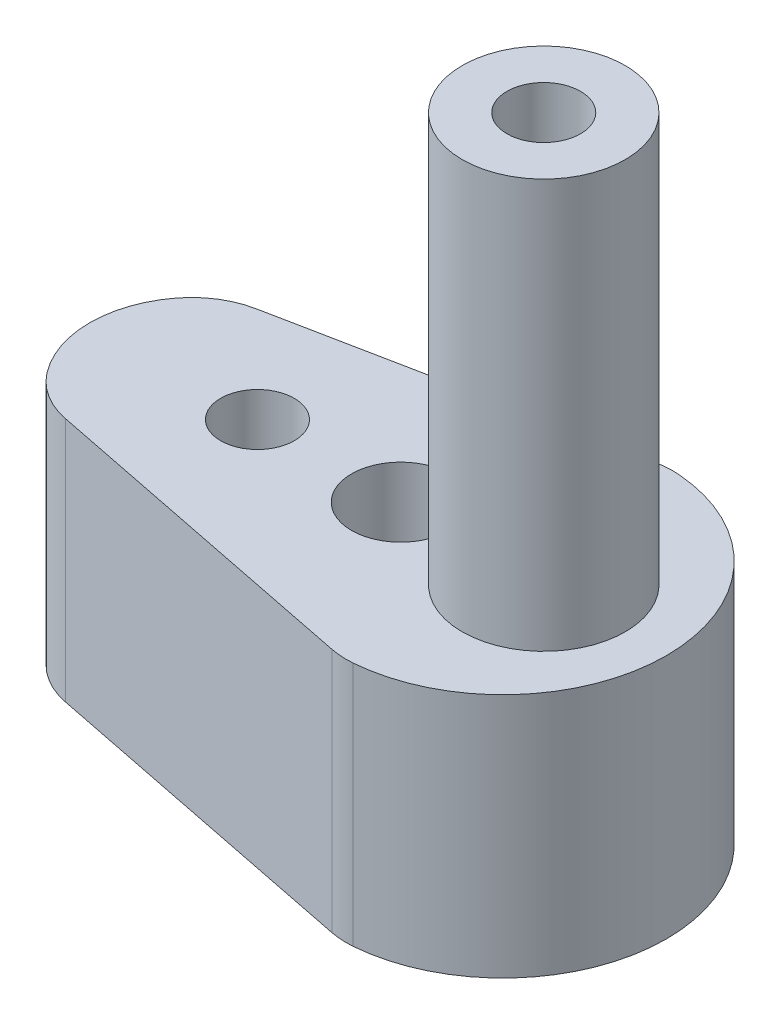
ISO-10303-21;
HEADER;
FILE_DESCRIPTION(('STEP AP214'),'2;1');
FILE_NAME('part.step','',(''),(''),'','','');
FILE_SCHEMA(('AUTOMOTIVE_DESIGN { 1 0 10303 214 1 1 1 1 }'));
ENDSEC;
DATA;
#1=APPLICATION_CONTEXT('core data for automotive mechanical design processes');
#2=APPLICATION_PROTOCOL_DEFINITION('international standard','automotive_design',2000,#1);
#3=PRODUCT_CONTEXT('',#1,'mechanical');
#4=PRODUCT('Part','Part','',(#3));
#5=PRODUCT_RELATED_PRODUCT_CATEGORY('part','',(#4));
#6=PRODUCT_DEFINITION_FORMATION('','',#4);
#7=PRODUCT_DEFINITION_CONTEXT('part definition',#1,'design');
#8=PRODUCT_DEFINITION('design','',#6,#7);
#9=PRODUCT_DEFINITION_SHAPE('','',#8);
#10=(LENGTH_UNIT() NAMED_UNIT(*) SI_UNIT(.MILLI.,.METRE.));
#11=(NAMED_UNIT(*) PLANE_ANGLE_UNIT() SI_UNIT($,.RADIAN.));
#12=(NAMED_UNIT(*) SI_UNIT($,.STERADIAN.) SOLID_ANGLE_UNIT());
#13=UNCERTAINTY_MEASURE_WITH_UNIT(LENGTH_MEASURE(1.E-05),#10,'distance_accuracy_value','');
#14=(GEOMETRIC_REPRESENTATION_CONTEXT(3) GLOBAL_UNCERTAINTY_ASSIGNED_CONTEXT((#13)) GLOBAL_UNIT_ASSIGNED_CONTEXT((#10,
#11,#12)) REPRESENTATION_CONTEXT('',''));
#15=CARTESIAN_POINT('',(0.,0.,0.));
#16=DIRECTION('',(0.,0.,1.));
#17=DIRECTION('',(1.,0.,0.));
#18=AXIS2_PLACEMENT_3D('',#15,#16,#17);
#19=CARTESIAN_POINT('',(0.,3.,0.));
#20=DIRECTION('',(0.,1.,0.));
#21=DIRECTION('',(0.,0.,1.));
#22=AXIS2_PLACEMENT_3D('',#19,#20,#21);
#23=PLANE('',#22);
#24=CARTESIAN_POINT('',(-1.24999999999968,3.,0.));
#25=DIRECTION('',(0.,1.,0.));
#26=DIRECTION('',(0.,0.,1.));
#27=AXIS2_PLACEMENT_3D('',#24,#25,#26);
#28=CIRCLE('',#27,0.6);
#29=CARTESIAN_POINT('',(-1.24999999999968,3.,0.599999999999994));
#30=VERTEX_POINT('',#29);
#31=EDGE_CURVE('E179',#30,#30,#28,.T.);
#32=ORIENTED_EDGE('',*,*,#31,.F.);
#33=EDGE_LOOP('',(#32));
#34=FACE_BOUND('',#33,.T.);
#35=CARTESIAN_POINT('',(-3.9873014814638,3.,0.183542929297438));
#36=DIRECTION('',(0.,1.,0.));
#37=DIRECTION('',(0.,0.,1.));
#38=AXIS2_PLACEMENT_3D('',#35,#36,#37);
#39=CIRCLE('',#38,1.);
#40=CARTESIAN_POINT('',(-4.183235690524,3.,1.16415997265328));
#41=VERTEX_POINT('',#40);
#42=CARTESIAN_POINT('',(-4.77830641967648,3.,0.795352693622231));
#43=VERTEX_POINT('',#42);
#44=EDGE_CURVE('E200',#41,#43,#39,.F.);
#45=ORIENTED_EDGE('',*,*,#44,.F.);
#46=DIRECTION('',(-0.980617043355843,0.,-0.195934209060197));
#47=VECTOR('',#46,1.);
#48=CARTESIAN_POINT('',(-0.384272849561752,3.,1.92321957143991));
#49=LINE('',#48,#47);
#50=CARTESIAN_POINT('',(-0.113883759971435,3.,1.97724522066388));
#51=VERTEX_POINT('',#50);
#52=EDGE_CURVE('E202',#51,#41,#49,.T.);
#53=ORIENTED_EDGE('',*,*,#52,.F.);
#54=CARTESIAN_POINT('',(0.0820504490887623,3.,0.996628177308034));
#55=DIRECTION('',(0.,1.,0.));
#56=DIRECTION('',(0.,0.,1.));
#57=AXIS2_PLACEMENT_3D('',#54,#55,#56);
#58=CIRCLE('',#57,1.);
#59=CARTESIAN_POINT('',(0.164100898177525,3.,1.99325635461607));
#60=VERTEX_POINT('',#59);
#61=EDGE_CURVE('E145',#51,#60,#58,.T.);
#62=ORIENTED_EDGE('',*,*,#61,.T.);
#63=CARTESIAN_POINT('',(-1.05819487287301E-11,3.,-1.28546370596616E-10));
#64=DIRECTION('',(0.,1.,0.));
#65=DIRECTION('',(0.,0.,1.));
#66=AXIS2_PLACEMENT_3D('',#63,#64,#65);
#67=CIRCLE('',#66,2.00000000012898);
#68=CARTESIAN_POINT('',(0.164100899999999,3.,-1.99325635472312));
#69=VERTEX_POINT('',#68);
#70=EDGE_CURVE('E205',#69,#60,#67,.F.);
#71=ORIENTED_EDGE('',*,*,#70,.F.);
#72=CARTESIAN_POINT('',(0.0820504499999999,3.,-0.996628177490106));
#73=DIRECTION('',(0.,1.,0.));
#74=DIRECTION('',(0.,0.,1.));
#75=AXIS2_PLACEMENT_3D('',#72,#73,#74);
#76=CIRCLE('',#75,1.);
#77=CARTESIAN_POINT('',(-0.113883759060197,3.,-1.97724522084595));
#78=VERTEX_POINT('',#77);
#79=EDGE_CURVE('E121',#69,#78,#76,.T.);
#80=ORIENTED_EDGE('',*,*,#79,.T.);
#81=DIRECTION('',(-0.980617043355843,0.,0.195934209060197));
#82=VECTOR('',#81,1.);
#83=CARTESIAN_POINT('',(-0.384272849561752,3.,-1.92321957143991));
#84=LINE('',#83,#82);
#85=CARTESIAN_POINT('',(-4.183235690524,3.,-1.16415997265328));
#86=VERTEX_POINT('',#85);
#87=EDGE_CURVE('E115',#78,#86,#84,.T.);
#88=ORIENTED_EDGE('',*,*,#87,.T.);
#89=CARTESIAN_POINT('',(-3.9873014814638,3.,-0.183542929297438));
#90=DIRECTION('',(0.,1.,0.));
#91=DIRECTION('',(0.,0.,1.));
#92=AXIS2_PLACEMENT_3D('',#89,#90,#91);
#93=CIRCLE('',#92,1.);
#94=CARTESIAN_POINT('',(-4.77830641967648,3.,-0.795352693622231));
#95=VERTEX_POINT('',#94);
#96=EDGE_CURVE('E107',#86,#95,#93,.T.);
#97=ORIENTED_EDGE('',*,*,#96,.T.);
#98=CARTESIAN_POINT('',(-3.75,3.,0.));
#99=DIRECTION('',(0.,1.,0.));
#100=DIRECTION('',(0.,0.,1.));
#101=AXIS2_PLACEMENT_3D('',#98,#99,#100);
#102=CIRCLE('',#101,1.3);
#103=EDGE_CURVE('E54',#95,#43,#102,.T.);
#104=ORIENTED_EDGE('',*,*,#103,.T.);
#105=EDGE_LOOP('',(#45,#53,#62,#71,#80,#88,#97,#104));
#106=FACE_BOUND('',#105,.T.);
#107=CARTESIAN_POINT('',(-3.,3.,0.));
#108=DIRECTION('',(0.,1.,0.));
#109=DIRECTION('',(0.,0.,1.));
#110=AXIS2_PLACEMENT_3D('',#107,#108,#109);
#111=CIRCLE('',#110,0.45);
#112=CARTESIAN_POINT('',(-3.,3.,0.45));
#113=VERTEX_POINT('',#112);
#114=EDGE_CURVE('E178',#113,#113,#111,.T.);
#115=ORIENTED_EDGE('',*,*,#114,.F.);
#116=EDGE_LOOP('',(#115));
#117=FACE_BOUND('',#116,.T.);
#118=CARTESIAN_POINT('',(0.5,3.,0.));
#119=DIRECTION('',(0.,1.,0.));
#120=DIRECTION('',(0.,0.,1.));
#121=AXIS2_PLACEMENT_3D('',#118,#119,#120);
#122=CIRCLE('',#121,0.996628177308034);
#123=CARTESIAN_POINT('',(0.5,3.,0.996628177308034));
#124=VERTEX_POINT('',#123);
#125=EDGE_CURVE('E186',#124,#124,#122,.F.);
#126=ORIENTED_EDGE('',*,*,#125,.T.);
#127=EDGE_LOOP('',(#126));
#128=FACE_BOUND('',#127,.T.);
#129=ADVANCED_FACE('F37',(#34,#106,#117,#128),#23,.T.);
#130=CARTESIAN_POINT('',(-3.9873014814638,3.,0.183542929297438));
#131=DIRECTION('',(0.,-1.,0.));
#132=DIRECTION('',(0.,0.,-1.));
#133=AXIS2_PLACEMENT_3D('',#130,#131,#132);
#134=CYLINDRICAL_SURFACE('',#133,1.);
#135=CARTESIAN_POINT('',(-3.9873014814638,0.,0.183542929297438));
#136=DIRECTION('',(0.,1.,0.));
#137=DIRECTION('',(0.,0.,1.));
#138=AXIS2_PLACEMENT_3D('',#135,#136,#137);
#139=CIRCLE('',#138,1.);
#140=CARTESIAN_POINT('',(-4.183235690524,0.,1.16415997265328));
#141=VERTEX_POINT('',#140);
#142=CARTESIAN_POINT('',(-4.77830641967648,0.,0.795352693622231));
#143=VERTEX_POINT('',#142);
#144=EDGE_CURVE('E159',#141,#143,#139,.F.);
#145=ORIENTED_EDGE('',*,*,#144,.F.);
#146=DIRECTION('',(0.,-1.,0.));
#147=VECTOR('',#146,1.);
#148=CARTESIAN_POINT('',(-4.183235690524,3.,1.16415997265328));
#149=LINE('',#148,#147);
#150=EDGE_CURVE('E11',#41,#141,#149,.T.);
#151=ORIENTED_EDGE('',*,*,#150,.F.);
#152=ORIENTED_EDGE('',*,*,#44,.T.);
#153=DIRECTION('',(0.,-1.,0.));
#154=VECTOR('',#153,1.);
#155=CARTESIAN_POINT('',(-4.77830641967648,3.,0.795352693622231));
#156=LINE('',#155,#154);
#157=EDGE_CURVE('E88',#43,#143,#156,.T.);
#158=ORIENTED_EDGE('',*,*,#157,.T.);
#159=EDGE_LOOP('',(#145,#151,#152,#158));
#160=FACE_BOUND('',#159,.T.);
#161=ADVANCED_FACE('F210',(#160),#134,.T.);
#162=CARTESIAN_POINT('',(-0.384272849561752,3.,1.92321957143991));
#163=DIRECTION('',(-0.195934209060197,0.,0.980617043355843));
#164=DIRECTION('',(0.980617043355843,0.,0.195934209060197));
#165=AXIS2_PLACEMENT_3D('',#162,#163,#164);
#166=PLANE('',#165);
#167=DIRECTION('',(-0.980617043355843,0.,-0.195934209060197));
#168=VECTOR('',#167,1.);
#169=CARTESIAN_POINT('',(-0.384272849561752,0.,1.92321957143991));
#170=LINE('',#169,#168);
#171=CARTESIAN_POINT('',(-0.113883759971435,0.,1.97724522066388));
#172=VERTEX_POINT('',#171);
#173=EDGE_CURVE('E153',#172,#141,#170,.T.);
#174=ORIENTED_EDGE('',*,*,#173,.F.);
#175=DIRECTION('',(0.,-1.,0.));
#176=VECTOR('',#175,1.);
#177=CARTESIAN_POINT('',(-0.113883759971435,3.,1.97724522066388));
#178=LINE('',#177,#176);
#179=EDGE_CURVE('E46',#51,#172,#178,.T.);
#180=ORIENTED_EDGE('',*,*,#179,.F.);
#181=ORIENTED_EDGE('',*,*,#52,.T.);
#182=ORIENTED_EDGE('',*,*,#150,.T.);
#183=EDGE_LOOP('',(#174,#180,#181,#182));
#184=FACE_BOUND('',#183,.T.);
#185=ADVANCED_FACE('F158',(#184),#166,.T.);
#186=CARTESIAN_POINT('',(0.0820504490887623,3.,0.996628177308034));
#187=DIRECTION('',(0.,-1.,0.));
#188=DIRECTION('',(0.,0.,-1.));
#189=AXIS2_PLACEMENT_3D('',#186,#187,#188);
#190=CYLINDRICAL_SURFACE('',#189,1.);
#191=CARTESIAN_POINT('',(0.0820504490887623,0.,0.996628177308034));
#192=DIRECTION('',(0.,1.,0.));
#193=DIRECTION('',(0.,0.,1.));
#194=AXIS2_PLACEMENT_3D('',#191,#192,#193);
#195=CIRCLE('',#194,1.);
#196=CARTESIAN_POINT('',(0.164100898177525,0.,1.99325635461607));
#197=VERTEX_POINT('',#196);
#198=EDGE_CURVE('E143',#172,#197,#195,.T.);
#199=ORIENTED_EDGE('',*,*,#198,.T.);
#200=DIRECTION('',(0.,-1.,0.));
#201=VECTOR('',#200,1.);
#202=CARTESIAN_POINT('',(0.164100898177525,3.,1.99325635461607));
#203=LINE('',#202,#201);
#204=EDGE_CURVE('E136',#60,#197,#203,.T.);
#205=ORIENTED_EDGE('',*,*,#204,.F.);
#206=ORIENTED_EDGE('',*,*,#61,.F.);
#207=ORIENTED_EDGE('',*,*,#179,.T.);
#208=EDGE_LOOP('',(#199,#205,#206,#207));
#209=FACE_BOUND('',#208,.T.);
#210=ADVANCED_FACE('F141',(#209),#190,.T.);
#211=CARTESIAN_POINT('',(-1.05819487287301E-11,3.,-1.28546370596616E-10));
#212=DIRECTION('',(0.,-1.,0.));
#213=DIRECTION('',(0.,0.,-1.));
#214=AXIS2_PLACEMENT_3D('',#211,#212,#213);
#215=CYLINDRICAL_SURFACE('',#214,2.00000000012898);
#216=CARTESIAN_POINT('',(-1.05819487287301E-11,0.,-1.28546370596616E-10));
#217=DIRECTION('',(0.,1.,0.));
#218=DIRECTION('',(0.,0.,1.));
#219=AXIS2_PLACEMENT_3D('',#216,#217,#218);
#220=CIRCLE('',#219,2.00000000012898);
#221=CARTESIAN_POINT('',(0.164100899999999,0.,-1.99325635472312));
#222=VERTEX_POINT('',#221);
#223=EDGE_CURVE('E156',#222,#197,#220,.F.);
#224=ORIENTED_EDGE('',*,*,#223,.F.);
#225=DIRECTION('',(0.,-1.,0.));
#226=VECTOR('',#225,1.);
#227=CARTESIAN_POINT('',(0.164100899999999,3.,-1.99325635472312));
#228=LINE('',#227,#226);
#229=EDGE_CURVE('E130',#69,#222,#228,.T.);
#230=ORIENTED_EDGE('',*,*,#229,.F.);
#231=ORIENTED_EDGE('',*,*,#70,.T.);
#232=ORIENTED_EDGE('',*,*,#204,.T.);
#233=EDGE_LOOP('',(#224,#230,#231,#232));
#234=FACE_BOUND('',#233,.T.);
#235=ADVANCED_FACE('F209',(#234),#215,.T.);
#236=CARTESIAN_POINT('',(0.0820504499999999,3.,-0.996628177490106));
#237=DIRECTION('',(0.,-1.,0.));
#238=DIRECTION('',(0.,0.,-1.));
#239=AXIS2_PLACEMENT_3D('',#236,#237,#238);
#240=CYLINDRICAL_SURFACE('',#239,1.);
#241=CARTESIAN_POINT('',(0.0820504499999999,0.,-0.996628177490106));
#242=DIRECTION('',(0.,1.,0.));
#243=DIRECTION('',(0.,0.,1.));
#244=AXIS2_PLACEMENT_3D('',#241,#242,#243);
#245=CIRCLE('',#244,1.);
#246=CARTESIAN_POINT('',(-0.113883759060197,0.,-1.97724522084595));
#247=VERTEX_POINT('',#246);
#248=EDGE_CURVE('E166',#222,#247,#245,.T.);
#249=ORIENTED_EDGE('',*,*,#248,.T.);
#250=DIRECTION('',(0.,-1.,0.));
#251=VECTOR('',#250,1.);
#252=CARTESIAN_POINT('',(-0.113883759060197,3.,-1.97724522084595));
#253=LINE('',#252,#251);
#254=EDGE_CURVE('E128',#78,#247,#253,.T.);
#255=ORIENTED_EDGE('',*,*,#254,.F.);
#256=ORIENTED_EDGE('',*,*,#79,.F.);
#257=ORIENTED_EDGE('',*,*,#229,.T.);
#258=EDGE_LOOP('',(#249,#255,#256,#257));
#259=FACE_BOUND('',#258,.T.);
#260=ADVANCED_FACE('F224',(#259),#240,.T.);
#261=CARTESIAN_POINT('',(-0.384272849561752,3.,-1.92321957143991));
#262=DIRECTION('',(0.195934209060197,0.,0.980617043355843));
#263=DIRECTION('',(0.980617043355843,0.,-0.195934209060197));
#264=AXIS2_PLACEMENT_3D('',#261,#262,#263);
#265=PLANE('',#264);
#266=DIRECTION('',(-0.980617043355843,0.,0.195934209060197));
#267=VECTOR('',#266,1.);
#268=CARTESIAN_POINT('',(-0.384272849561752,0.,-1.92321957143991));
#269=LINE('',#268,#267);
#270=CARTESIAN_POINT('',(-4.183235690524,0.,-1.16415997265328));
#271=VERTEX_POINT('',#270);
#272=EDGE_CURVE('E127',#247,#271,#269,.T.);
#273=ORIENTED_EDGE('',*,*,#272,.T.);
#274=DIRECTION('',(0.,-1.,0.));
#275=VECTOR('',#274,1.);
#276=CARTESIAN_POINT('',(-4.183235690524,3.,-1.16415997265328));
#277=LINE('',#276,#275);
#278=EDGE_CURVE('E112',#86,#271,#277,.T.);
#279=ORIENTED_EDGE('',*,*,#278,.F.);
#280=ORIENTED_EDGE('',*,*,#87,.F.);
#281=ORIENTED_EDGE('',*,*,#254,.T.);
#282=EDGE_LOOP('',(#273,#279,#280,#281));
#283=FACE_BOUND('',#282,.T.);
#284=ADVANCED_FACE('F126',(#283),#265,.F.);
#285=CARTESIAN_POINT('',(-3.9873014814638,3.,-0.183542929297438));
#286=DIRECTION('',(0.,-1.,0.));
#287=DIRECTION('',(0.,0.,-1.));
#288=AXIS2_PLACEMENT_3D('',#285,#286,#287);
#289=CYLINDRICAL_SURFACE('',#288,1.);
#290=CARTESIAN_POINT('',(-3.9873014814638,0.,-0.183542929297438));
#291=DIRECTION('',(0.,1.,0.));
#292=DIRECTION('',(0.,0.,1.));
#293=AXIS2_PLACEMENT_3D('',#290,#291,#292);
#294=CIRCLE('',#293,1.);
#295=CARTESIAN_POINT('',(-4.77830641967648,0.,-0.795352693622231));
#296=VERTEX_POINT('',#295);
#297=EDGE_CURVE('E170',#271,#296,#294,.T.);
#298=ORIENTED_EDGE('',*,*,#297,.T.);
#299=DIRECTION('',(0.,-1.,0.));
#300=VECTOR('',#299,1.);
#301=CARTESIAN_POINT('',(-4.77830641967648,3.,-0.795352693622231));
#302=LINE('',#301,#300);
#303=EDGE_CURVE('E114',#95,#296,#302,.T.);
#304=ORIENTED_EDGE('',*,*,#303,.F.);
#305=ORIENTED_EDGE('',*,*,#96,.F.);
#306=ORIENTED_EDGE('',*,*,#278,.T.);
#307=EDGE_LOOP('',(#298,#304,#305,#306));
#308=FACE_BOUND('',#307,.T.);
#309=ADVANCED_FACE('F110',(#308),#289,.T.);
#310=CARTESIAN_POINT('',(-1.24999999999968,3.,0.));
#311=DIRECTION('',(0.,-1.,0.));
#312=DIRECTION('',(0.,0.,-1.));
#313=AXIS2_PLACEMENT_3D('',#310,#311,#312);
#314=CYLINDRICAL_SURFACE('',#313,0.6);
#315=ORIENTED_EDGE('',*,*,#31,.T.);
#316=EDGE_LOOP('',(#315));
#317=FACE_BOUND('',#316,.T.);
#318=CARTESIAN_POINT('',(-1.24999999999968,0.,0.));
#319=DIRECTION('',(0.,1.,0.));
#320=DIRECTION('',(0.,0.,1.));
#321=AXIS2_PLACEMENT_3D('',#318,#319,#320);
#322=CIRCLE('',#321,0.6);
#323=CARTESIAN_POINT('',(-1.24999999999968,0.,0.599999999999994));
#324=VERTEX_POINT('',#323);
#325=EDGE_CURVE('E173',#324,#324,#322,.T.);
#326=ORIENTED_EDGE('',*,*,#325,.F.);
#327=EDGE_LOOP('',(#326));
#328=FACE_BOUND('',#327,.T.);
#329=ADVANCED_FACE('F232',(#317,#328),#314,.F.);
#330=CARTESIAN_POINT('',(-3.75,3.,0.));
#331=DIRECTION('',(0.,-1.,0.));
#332=DIRECTION('',(0.,0.,-1.));
#333=AXIS2_PLACEMENT_3D('',#330,#331,#332);
#334=CYLINDRICAL_SURFACE('',#333,1.3);
#335=CARTESIAN_POINT('',(-3.75,0.,0.));
#336=DIRECTION('',(0.,1.,0.));
#337=DIRECTION('',(0.,0.,1.));
#338=AXIS2_PLACEMENT_3D('',#335,#336,#337);
#339=CIRCLE('',#338,1.3);
#340=EDGE_CURVE('E81',#296,#143,#339,.T.);
#341=ORIENTED_EDGE('',*,*,#340,.T.);
#342=ORIENTED_EDGE('',*,*,#157,.F.);
#343=ORIENTED_EDGE('',*,*,#103,.F.);
#344=ORIENTED_EDGE('',*,*,#303,.T.);
#345=EDGE_LOOP('',(#341,#342,#343,#344));
#346=FACE_BOUND('',#345,.T.);
#347=ADVANCED_FACE('F233',(#346),#334,.T.);
#348=CARTESIAN_POINT('',(-3.,3.,0.));
#349=DIRECTION('',(0.,-1.,0.));
#350=DIRECTION('',(0.,0.,-1.));
#351=AXIS2_PLACEMENT_3D('',#348,#349,#350);
#352=CYLINDRICAL_SURFACE('',#351,0.45);
#353=ORIENTED_EDGE('',*,*,#114,.T.);
#354=EDGE_LOOP('',(#353));
#355=FACE_BOUND('',#354,.T.);
#356=CARTESIAN_POINT('',(-3.,0.,0.));
#357=DIRECTION('',(0.,1.,0.));
#358=DIRECTION('',(0.,0.,1.));
#359=AXIS2_PLACEMENT_3D('',#356,#357,#358);
#360=CIRCLE('',#359,0.45);
#361=CARTESIAN_POINT('',(-3.,0.,0.45));
#362=VERTEX_POINT('',#361);
#363=EDGE_CURVE('E161',#362,#362,#360,.T.);
#364=ORIENTED_EDGE('',*,*,#363,.F.);
#365=EDGE_LOOP('',(#364));
#366=FACE_BOUND('',#365,.T.);
#367=ADVANCED_FACE('F39',(#355,#366),#352,.F.);
#368=CARTESIAN_POINT('',(0.5,3.,0.));
#369=DIRECTION('',(0.,-1.,0.));
#370=DIRECTION('',(0.,0.,-1.));
#371=AXIS2_PLACEMENT_3D('',#368,#369,#370);
#372=CYLINDRICAL_SURFACE('',#371,0.45);
#373=CARTESIAN_POINT('',(0.5,0.,0.));
#374=DIRECTION('',(0.,1.,0.));
#375=DIRECTION('',(0.,0.,1.));
#376=AXIS2_PLACEMENT_3D('',#373,#374,#375);
#377=CIRCLE('',#376,0.45);
#378=CARTESIAN_POINT('',(0.5,0.,0.45));
#379=VERTEX_POINT('',#378);
#380=EDGE_CURVE('E176',#379,#379,#377,.T.);
#381=ORIENTED_EDGE('',*,*,#380,.F.);
#382=EDGE_LOOP('',(#381));
#383=FACE_BOUND('',#382,.T.);
#384=CARTESIAN_POINT('',(0.5,8.,0.));
#385=DIRECTION('',(0.,1.,0.));
#386=DIRECTION('',(0.,0.,1.));
#387=AXIS2_PLACEMENT_3D('',#384,#385,#386);
#388=CIRCLE('',#387,0.45);
#389=CARTESIAN_POINT('',(0.5,8.,0.45));
#390=VERTEX_POINT('',#389);
#391=EDGE_CURVE('E194',#390,#390,#388,.T.);
#392=ORIENTED_EDGE('',*,*,#391,.T.);
#393=EDGE_LOOP('',(#392));
#394=FACE_BOUND('',#393,.T.);
#395=ADVANCED_FACE('F239',(#383,#394),#372,.F.);
#396=CARTESIAN_POINT('',(0.,0.,0.));
#397=DIRECTION('',(0.,1.,0.));
#398=DIRECTION('',(0.,0.,1.));
#399=AXIS2_PLACEMENT_3D('',#396,#397,#398);
#400=PLANE('',#399);
#401=ORIENTED_EDGE('',*,*,#380,.T.);
#402=EDGE_LOOP('',(#401));
#403=FACE_BOUND('',#402,.T.);
#404=ORIENTED_EDGE('',*,*,#325,.T.);
#405=EDGE_LOOP('',(#404));
#406=FACE_BOUND('',#405,.T.);
#407=ORIENTED_EDGE('',*,*,#144,.T.);
#408=ORIENTED_EDGE('',*,*,#340,.F.);
#409=ORIENTED_EDGE('',*,*,#297,.F.);
#410=ORIENTED_EDGE('',*,*,#272,.F.);
#411=ORIENTED_EDGE('',*,*,#248,.F.);
#412=ORIENTED_EDGE('',*,*,#223,.T.);
#413=ORIENTED_EDGE('',*,*,#198,.F.);
#414=ORIENTED_EDGE('',*,*,#173,.T.);
#415=EDGE_LOOP('',(#407,#408,#409,#410,#411,#412,#413,#414));
#416=FACE_BOUND('',#415,.T.);
#417=ORIENTED_EDGE('',*,*,#363,.T.);
#418=EDGE_LOOP('',(#417));
#419=FACE_BOUND('',#418,.T.);
#420=ADVANCED_FACE('F151',(#403,#406,#416,#419),#400,.F.);
#421=CARTESIAN_POINT('',(0.5,8.,0.));
#422=DIRECTION('',(0.,-1.,0.));
#423=DIRECTION('',(0.,0.,-1.));
#424=AXIS2_PLACEMENT_3D('',#421,#422,#423);
#425=CYLINDRICAL_SURFACE('',#424,0.996628177308034);
#426=ORIENTED_EDGE('',*,*,#125,.F.);
#427=EDGE_LOOP('',(#426));
#428=FACE_BOUND('',#427,.T.);
#429=CARTESIAN_POINT('',(0.5,8.,0.));
#430=DIRECTION('',(0.,1.,0.));
#431=DIRECTION('',(0.,0.,1.));
#432=AXIS2_PLACEMENT_3D('',#429,#430,#431);
#433=CIRCLE('',#432,0.996628177308034);
#434=CARTESIAN_POINT('',(0.5,8.,0.996628177308034));
#435=VERTEX_POINT('',#434);
#436=EDGE_CURVE('E189',#435,#435,#433,.T.);
#437=ORIENTED_EDGE('',*,*,#436,.F.);
#438=EDGE_LOOP('',(#437));
#439=FACE_BOUND('',#438,.T.);
#440=ADVANCED_FACE('F244',(#428,#439),#425,.T.);
#441=CARTESIAN_POINT('',(0.,8.,0.));
#442=DIRECTION('',(0.,1.,0.));
#443=DIRECTION('',(0.,0.,1.));
#444=AXIS2_PLACEMENT_3D('',#441,#442,#443);
#445=PLANE('',#444);
#446=ORIENTED_EDGE('',*,*,#391,.F.);
#447=EDGE_LOOP('',(#446));
#448=FACE_BOUND('',#447,.T.);
#449=ORIENTED_EDGE('',*,*,#436,.T.);
#450=EDGE_LOOP('',(#449));
#451=FACE_BOUND('',#450,.T.);
#452=ADVANCED_FACE('F249',(#448,#451),#445,.T.);
#453=CLOSED_SHELL('',(#129,#161,#185,#210,#235,#260,#284,#309,#329,#347,#367,#395,#420,#440,#452));
#454=MANIFOLD_SOLID_BREP('B2',#453);
#455=ADVANCED_BREP_SHAPE_REPRESENTATION('',(#18,#454),#14);
#456=SHAPE_DEFINITION_REPRESENTATION(#9,#455);
ENDSEC;
END-ISO-10303-21;
